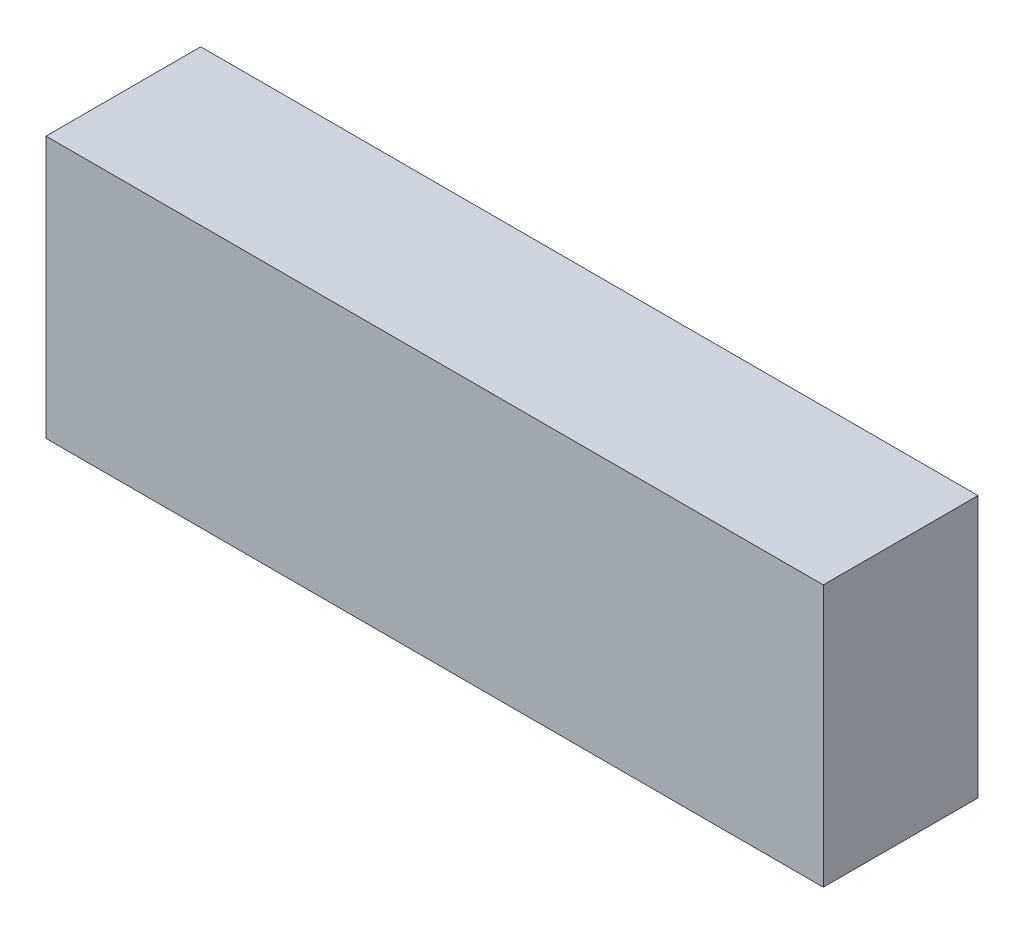
ISO-10303-21;
HEADER;
FILE_DESCRIPTION(('STEP AP214'),'2;1');
FILE_NAME('part.step','',(''),(''),'','','');
FILE_SCHEMA(('AUTOMOTIVE_DESIGN { 1 0 10303 214 1 1 1 1 }'));
ENDSEC;
DATA;
#1=APPLICATION_CONTEXT('core data for automotive mechanical design processes');
#2=APPLICATION_PROTOCOL_DEFINITION('international standard','automotive_design',2000,#1);
#3=PRODUCT_CONTEXT('',#1,'mechanical');
#4=PRODUCT('Part','Part','',(#3));
#5=PRODUCT_RELATED_PRODUCT_CATEGORY('part','',(#4));
#6=PRODUCT_DEFINITION_FORMATION('','',#4);
#7=PRODUCT_DEFINITION_CONTEXT('part definition',#1,'design');
#8=PRODUCT_DEFINITION('design','',#6,#7);
#9=PRODUCT_DEFINITION_SHAPE('','',#8);
#10=(LENGTH_UNIT() NAMED_UNIT(*) SI_UNIT(.MILLI.,.METRE.));
#11=(NAMED_UNIT(*) PLANE_ANGLE_UNIT() SI_UNIT($,.RADIAN.));
#12=(NAMED_UNIT(*) SI_UNIT($,.STERADIAN.) SOLID_ANGLE_UNIT());
#13=UNCERTAINTY_MEASURE_WITH_UNIT(LENGTH_MEASURE(1.E-05),#10,'distance_accuracy_value','');
#14=(GEOMETRIC_REPRESENTATION_CONTEXT(3) GLOBAL_UNCERTAINTY_ASSIGNED_CONTEXT((#13)) GLOBAL_UNIT_ASSIGNED_CONTEXT((#10,
#11,#12)) REPRESENTATION_CONTEXT('',''));
#15=CARTESIAN_POINT('',(0.,0.,0.));
#16=DIRECTION('',(0.,0.,1.));
#17=DIRECTION('',(1.,0.,0.));
#18=AXIS2_PLACEMENT_3D('',#15,#16,#17);
#19=CARTESIAN_POINT('',(-7.53679976,2.53870206,2.99999908));
#20=DIRECTION('',(0.,0.,1.));
#21=DIRECTION('',(1.,0.,0.));
#22=AXIS2_PLACEMENT_3D('',#19,#20,#21);
#23=PLANE('',#22);
#24=DIRECTION('',(-5.00256130547637E-07,0.999999999999875,0.));
#25=VECTOR('',#24,1.);
#26=CARTESIAN_POINT('',(7.53679722,2.53869952,2.99999908));
#27=LINE('',#26,#25);
#28=CARTESIAN_POINT('',(7.53679849,2.53869951999999,2.99999908));
#29=VERTEX_POINT('',#28);
#30=CARTESIAN_POINT('',(7.53679976,-2.53869825,2.99999908));
#31=VERTEX_POINT('',#30);
#32=EDGE_CURVE('E53',#29,#31,#27,.F.);
#33=ORIENTED_EDGE('',*,*,#32,.F.);
#34=DIRECTION('',(-0.999999999999986,1.68506563416098E-07,0.));
#35=VECTOR('',#34,1.);
#36=CARTESIAN_POINT('',(-7.53679976,2.53870206,2.99999908));
#37=LINE('',#36,#35);
#38=CARTESIAN_POINT('',(-7.53679976000001,2.538701425,2.99999908));
#39=VERTEX_POINT('',#38);
#40=EDGE_CURVE('E68',#39,#29,#37,.F.);
#41=ORIENTED_EDGE('',*,*,#40,.F.);
#42=DIRECTION('',(5.00256136145337E-07,-0.999999999999875,0.));
#43=VECTOR('',#42,1.);
#44=CARTESIAN_POINT('',(-7.53679722,-2.53869698,2.99999908));
#45=LINE('',#44,#43);
#46=CARTESIAN_POINT('',(-7.53679849,-2.53869697999999,2.99999908));
#47=VERTEX_POINT('',#46);
#48=EDGE_CURVE('E20',#47,#39,#45,.F.);
#49=ORIENTED_EDGE('',*,*,#48,.F.);
#50=DIRECTION('',(0.999999999999986,-1.68506563416098E-07,0.));
#51=VECTOR('',#50,1.);
#52=CARTESIAN_POINT('',(7.53679976,-2.53869952,2.99999908));
#53=LINE('',#52,#51);
#54=EDGE_CURVE('E58',#31,#47,#53,.F.);
#55=ORIENTED_EDGE('',*,*,#54,.F.);
#56=EDGE_LOOP('',(#33,#41,#49,#55));
#57=FACE_BOUND('',#56,.T.);
#58=ADVANCED_FACE('F17',(#57),#23,.T.);
#59=CARTESIAN_POINT('',(-7.53679722,-2.53869698,0.));
#60=DIRECTION('',(-0.999999999999875,-5.00256136145337E-07,0.));
#61=DIRECTION('',(5.00256136145337E-07,-0.999999999999875,0.));
#62=AXIS2_PLACEMENT_3D('',#59,#60,#61);
#63=PLANE('',#62);
#64=DIRECTION('',(0.,0.,1.));
#65=VECTOR('',#64,1.);
#66=CARTESIAN_POINT('',(-7.53679976,2.53870206,0.));
#67=LINE('',#66,#65);
#68=CARTESIAN_POINT('',(-7.53679976000001,2.538701425,0.));
#69=VERTEX_POINT('',#68);
#70=EDGE_CURVE('E79',#69,#39,#67,.T.);
#71=ORIENTED_EDGE('',*,*,#70,.F.);
#72=DIRECTION('',(0.,1.,0.));
#73=VECTOR('',#72,1.);
#74=CARTESIAN_POINT('',(-7.53679976,2.53870206,0.));
#75=LINE('',#74,#73);
#76=CARTESIAN_POINT('',(-7.536797855,-2.53869697999999,0.));
#77=VERTEX_POINT('',#76);
#78=EDGE_CURVE('E74',#69,#77,#75,.F.);
#79=ORIENTED_EDGE('',*,*,#78,.T.);
#80=DIRECTION('',(0.,0.,1.));
#81=VECTOR('',#80,1.);
#82=CARTESIAN_POINT('',(-7.53679722,-2.53869697999997,0.));
#83=LINE('',#82,#81);
#84=EDGE_CURVE('E63',#47,#77,#83,.F.);
#85=ORIENTED_EDGE('',*,*,#84,.F.);
#86=ORIENTED_EDGE('',*,*,#48,.T.);
#87=EDGE_LOOP('',(#71,#79,#85,#86));
#88=FACE_BOUND('',#87,.T.);
#89=ADVANCED_FACE('F73',(#88),#63,.T.);
#90=CARTESIAN_POINT('',(7.53679976,-2.53869952,0.));
#91=DIRECTION('',(-1.68506563416098E-07,-0.999999999999986,0.));
#92=DIRECTION('',(0.999999999999986,-1.68506563416098E-07,0.));
#93=AXIS2_PLACEMENT_3D('',#90,#91,#92);
#94=PLANE('',#93);
#95=ORIENTED_EDGE('',*,*,#84,.T.);
#96=DIRECTION('',(1.,0.,0.));
#97=VECTOR('',#96,1.);
#98=CARTESIAN_POINT('',(-7.53679976,-2.53869698,0.));
#99=LINE('',#98,#97);
#100=CARTESIAN_POINT('',(7.53679976,-2.538698885,0.));
#101=VERTEX_POINT('',#100);
#102=EDGE_CURVE('E84',#77,#101,#99,.T.);
#103=ORIENTED_EDGE('',*,*,#102,.T.);
#104=DIRECTION('',(0.,0.,1.));
#105=VECTOR('',#104,1.);
#106=CARTESIAN_POINT('',(7.53679976,-2.53869952,0.));
#107=LINE('',#106,#105);
#108=EDGE_CURVE('E65',#31,#101,#107,.F.);
#109=ORIENTED_EDGE('',*,*,#108,.F.);
#110=ORIENTED_EDGE('',*,*,#54,.T.);
#111=EDGE_LOOP('',(#95,#103,#109,#110));
#112=FACE_BOUND('',#111,.T.);
#113=ADVANCED_FACE('F60',(#112),#94,.T.);
#114=CARTESIAN_POINT('',(7.53679722,2.53869952,0.));
#115=DIRECTION('',(0.999999999999875,5.00256130547637E-07,0.));
#116=DIRECTION('',(-5.00256130547637E-07,0.999999999999875,0.));
#117=AXIS2_PLACEMENT_3D('',#114,#115,#116);
#118=PLANE('',#117);
#119=ORIENTED_EDGE('',*,*,#108,.T.);
#120=DIRECTION('',(0.,1.,0.));
#121=VECTOR('',#120,1.);
#122=CARTESIAN_POINT('',(7.53679976,2.53870206,0.));
#123=LINE('',#122,#121);
#124=CARTESIAN_POINT('',(7.536797855,2.53869951999999,0.));
#125=VERTEX_POINT('',#124);
#126=EDGE_CURVE('E26',#101,#125,#123,.T.);
#127=ORIENTED_EDGE('',*,*,#126,.T.);
#128=DIRECTION('',(0.,0.,1.));
#129=VECTOR('',#128,1.);
#130=CARTESIAN_POINT('',(7.53679722,2.53869951999997,0.));
#131=LINE('',#130,#129);
#132=EDGE_CURVE('E34',#29,#125,#131,.F.);
#133=ORIENTED_EDGE('',*,*,#132,.F.);
#134=ORIENTED_EDGE('',*,*,#32,.T.);
#135=EDGE_LOOP('',(#119,#127,#133,#134));
#136=FACE_BOUND('',#135,.T.);
#137=ADVANCED_FACE('F88',(#136),#118,.T.);
#138=CARTESIAN_POINT('',(-7.53679976,2.53870206,0.));
#139=DIRECTION('',(1.68506563416098E-07,0.999999999999986,0.));
#140=DIRECTION('',(-0.999999999999986,1.68506563416098E-07,0.));
#141=AXIS2_PLACEMENT_3D('',#138,#139,#140);
#142=PLANE('',#141);
#143=ORIENTED_EDGE('',*,*,#132,.T.);
#144=DIRECTION('',(1.,0.,0.));
#145=VECTOR('',#144,1.);
#146=CARTESIAN_POINT('',(-7.53679976,2.53869952,0.));
#147=LINE('',#146,#145);
#148=EDGE_CURVE('E11',#125,#69,#147,.F.);
#149=ORIENTED_EDGE('',*,*,#148,.T.);
#150=ORIENTED_EDGE('',*,*,#70,.T.);
#151=ORIENTED_EDGE('',*,*,#40,.T.);
#152=EDGE_LOOP('',(#143,#149,#150,#151));
#153=FACE_BOUND('',#152,.T.);
#154=ADVANCED_FACE('F91',(#153),#142,.T.);
#155=CARTESIAN_POINT('',(-7.53679976,2.53870206,0.));
#156=DIRECTION('',(0.,0.,1.));
#157=DIRECTION('',(1.,0.,0.));
#158=AXIS2_PLACEMENT_3D('',#155,#156,#157);
#159=PLANE('',#158);
#160=ORIENTED_EDGE('',*,*,#126,.F.);
#161=ORIENTED_EDGE('',*,*,#102,.F.);
#162=ORIENTED_EDGE('',*,*,#78,.F.);
#163=ORIENTED_EDGE('',*,*,#148,.F.);
#164=EDGE_LOOP('',(#160,#161,#162,#163));
#165=FACE_BOUND('',#164,.T.);
#166=ADVANCED_FACE('F90',(#165),#159,.F.);
#167=CLOSED_SHELL('',(#58,#89,#113,#137,#154,#166));
#168=MANIFOLD_SOLID_BREP('B1',#167);
#169=ADVANCED_BREP_SHAPE_REPRESENTATION('',(#18,#168),#14);
#170=SHAPE_DEFINITION_REPRESENTATION(#9,#169);
ENDSEC;
END-ISO-10303-21;
